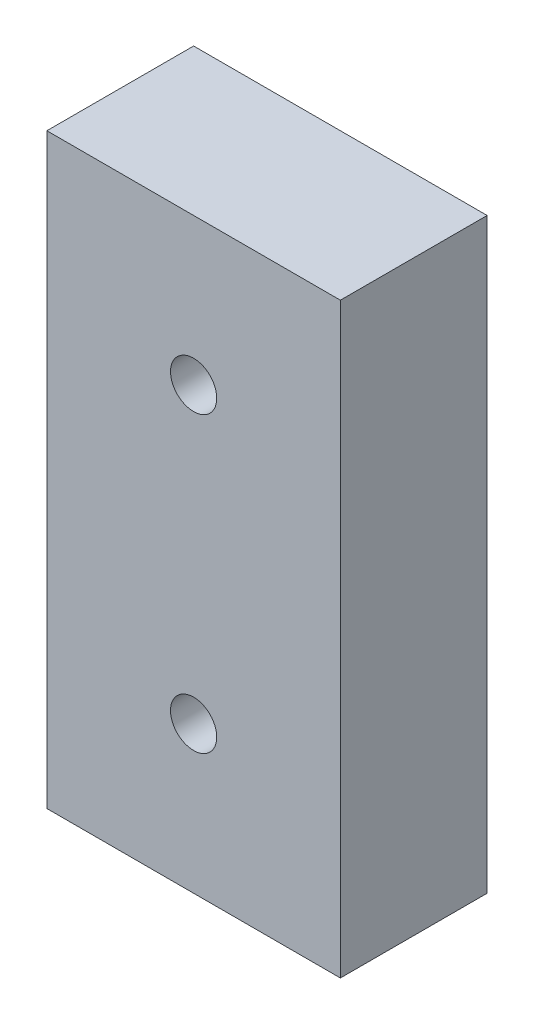
ISO-10303-21;
HEADER;
FILE_DESCRIPTION(('STEP AP214'),'2;1');
FILE_NAME('part.step','',(''),(''),'','','');
FILE_SCHEMA(('AUTOMOTIVE_DESIGN { 1 0 10303 214 1 1 1 1 }'));
ENDSEC;
DATA;
#1=APPLICATION_CONTEXT('core data for automotive mechanical design processes');
#2=APPLICATION_PROTOCOL_DEFINITION('international standard','automotive_design',2000,#1);
#3=PRODUCT_CONTEXT('',#1,'mechanical');
#4=PRODUCT('Part','Part','',(#3));
#5=PRODUCT_RELATED_PRODUCT_CATEGORY('part','',(#4));
#6=PRODUCT_DEFINITION_FORMATION('','',#4);
#7=PRODUCT_DEFINITION_CONTEXT('part definition',#1,'design');
#8=PRODUCT_DEFINITION('design','',#6,#7);
#9=PRODUCT_DEFINITION_SHAPE('','',#8);
#10=(LENGTH_UNIT() NAMED_UNIT(*) SI_UNIT(.MILLI.,.METRE.));
#11=(NAMED_UNIT(*) PLANE_ANGLE_UNIT() SI_UNIT($,.RADIAN.));
#12=(NAMED_UNIT(*) SI_UNIT($,.STERADIAN.) SOLID_ANGLE_UNIT());
#13=UNCERTAINTY_MEASURE_WITH_UNIT(LENGTH_MEASURE(1.E-05),#10,'distance_accuracy_value','');
#14=(GEOMETRIC_REPRESENTATION_CONTEXT(3) GLOBAL_UNCERTAINTY_ASSIGNED_CONTEXT((#13)) GLOBAL_UNIT_ASSIGNED_CONTEXT((#10,
#11,#12)) REPRESENTATION_CONTEXT('',''));
#15=CARTESIAN_POINT('',(0.,0.,0.));
#16=DIRECTION('',(0.,0.,1.));
#17=DIRECTION('',(1.,0.,0.));
#18=AXIS2_PLACEMENT_3D('',#15,#16,#17);
#19=CARTESIAN_POINT('',(0.,0.,10.));
#20=DIRECTION('',(1.,0.,0.));
#21=DIRECTION('',(0.,1.,0.));
#22=AXIS2_PLACEMENT_3D('',#19,#20,#21);
#23=PLANE('',#22);
#24=DIRECTION('',(0.,-1.,0.));
#25=VECTOR('',#24,1.);
#26=CARTESIAN_POINT('',(0.,0.,0.));
#27=LINE('',#26,#25);
#28=CARTESIAN_POINT('',(0.,0.,0.));
#29=VERTEX_POINT('',#28);
#30=CARTESIAN_POINT('',(0.,-40.,0.));
#31=VERTEX_POINT('',#30);
#32=EDGE_CURVE('E111',#29,#31,#27,.T.);
#33=ORIENTED_EDGE('',*,*,#32,.T.);
#34=DIRECTION('',(0.,0.,-1.));
#35=VECTOR('',#34,1.);
#36=CARTESIAN_POINT('',(0.,-40.,10.));
#37=LINE('',#36,#35);
#38=CARTESIAN_POINT('',(0.,-40.,10.));
#39=VERTEX_POINT('',#38);
#40=EDGE_CURVE('E11',#39,#31,#37,.T.);
#41=ORIENTED_EDGE('',*,*,#40,.F.);
#42=DIRECTION('',(0.,-1.,0.));
#43=VECTOR('',#42,1.);
#44=CARTESIAN_POINT('',(0.,0.,10.));
#45=LINE('',#44,#43);
#46=CARTESIAN_POINT('',(0.,0.,10.));
#47=VERTEX_POINT('',#46);
#48=EDGE_CURVE('E95',#47,#39,#45,.T.);
#49=ORIENTED_EDGE('',*,*,#48,.F.);
#50=DIRECTION('',(0.,0.,-1.));
#51=VECTOR('',#50,1.);
#52=CARTESIAN_POINT('',(0.,0.,10.));
#53=LINE('',#52,#51);
#54=EDGE_CURVE('E107',#47,#29,#53,.T.);
#55=ORIENTED_EDGE('',*,*,#54,.T.);
#56=EDGE_LOOP('',(#33,#41,#49,#55));
#57=FACE_BOUND('',#56,.T.);
#58=ADVANCED_FACE('F43',(#57),#23,.F.);
#59=CARTESIAN_POINT('',(0.,-40.,10.));
#60=DIRECTION('',(0.,1.,0.));
#61=DIRECTION('',(0.,0.,1.));
#62=AXIS2_PLACEMENT_3D('',#59,#60,#61);
#63=PLANE('',#62);
#64=DIRECTION('',(1.,0.,0.));
#65=VECTOR('',#64,1.);
#66=CARTESIAN_POINT('',(0.,-40.,0.));
#67=LINE('',#66,#65);
#68=CARTESIAN_POINT('',(20.,-40.,0.));
#69=VERTEX_POINT('',#68);
#70=EDGE_CURVE('E100',#31,#69,#67,.T.);
#71=ORIENTED_EDGE('',*,*,#70,.T.);
#72=DIRECTION('',(0.,0.,-1.));
#73=VECTOR('',#72,1.);
#74=CARTESIAN_POINT('',(20.,-40.,10.));
#75=LINE('',#74,#73);
#76=CARTESIAN_POINT('',(20.,-40.,10.));
#77=VERTEX_POINT('',#76);
#78=EDGE_CURVE('E52',#77,#69,#75,.T.);
#79=ORIENTED_EDGE('',*,*,#78,.F.);
#80=DIRECTION('',(1.,0.,0.));
#81=VECTOR('',#80,1.);
#82=CARTESIAN_POINT('',(0.,-40.,10.));
#83=LINE('',#82,#81);
#84=EDGE_CURVE('E90',#39,#77,#83,.T.);
#85=ORIENTED_EDGE('',*,*,#84,.F.);
#86=ORIENTED_EDGE('',*,*,#40,.T.);
#87=EDGE_LOOP('',(#71,#79,#85,#86));
#88=FACE_BOUND('',#87,.T.);
#89=ADVANCED_FACE('F99',(#88),#63,.F.);
#90=CARTESIAN_POINT('',(20.,0.,10.));
#91=DIRECTION('',(-1.,0.,0.));
#92=DIRECTION('',(0.,0.,1.));
#93=AXIS2_PLACEMENT_3D('',#90,#91,#92);
#94=PLANE('',#93);
#95=DIRECTION('',(0.,1.,0.));
#96=VECTOR('',#95,1.);
#97=CARTESIAN_POINT('',(20.,0.,0.));
#98=LINE('',#97,#96);
#99=CARTESIAN_POINT('',(20.,0.,0.));
#100=VERTEX_POINT('',#99);
#101=EDGE_CURVE('E77',#69,#100,#98,.T.);
#102=ORIENTED_EDGE('',*,*,#101,.T.);
#103=DIRECTION('',(0.,0.,-1.));
#104=VECTOR('',#103,1.);
#105=CARTESIAN_POINT('',(20.,0.,10.));
#106=LINE('',#105,#104);
#107=CARTESIAN_POINT('',(20.,0.,10.));
#108=VERTEX_POINT('',#107);
#109=EDGE_CURVE('E102',#108,#100,#106,.T.);
#110=ORIENTED_EDGE('',*,*,#109,.F.);
#111=DIRECTION('',(0.,1.,0.));
#112=VECTOR('',#111,1.);
#113=CARTESIAN_POINT('',(20.,0.,10.));
#114=LINE('',#113,#112);
#115=EDGE_CURVE('E93',#77,#108,#114,.T.);
#116=ORIENTED_EDGE('',*,*,#115,.F.);
#117=ORIENTED_EDGE('',*,*,#78,.T.);
#118=EDGE_LOOP('',(#102,#110,#116,#117));
#119=FACE_BOUND('',#118,.T.);
#120=ADVANCED_FACE('F103',(#119),#94,.F.);
#121=CARTESIAN_POINT('',(0.,0.,10.));
#122=DIRECTION('',(0.,-1.,0.));
#123=DIRECTION('',(0.,0.,-1.));
#124=AXIS2_PLACEMENT_3D('',#121,#122,#123);
#125=PLANE('',#124);
#126=DIRECTION('',(-1.,0.,0.));
#127=VECTOR('',#126,1.);
#128=CARTESIAN_POINT('',(0.,0.,0.));
#129=LINE('',#128,#127);
#130=EDGE_CURVE('E83',#100,#29,#129,.T.);
#131=ORIENTED_EDGE('',*,*,#130,.T.);
#132=ORIENTED_EDGE('',*,*,#54,.F.);
#133=DIRECTION('',(-1.,0.,0.));
#134=VECTOR('',#133,1.);
#135=CARTESIAN_POINT('',(0.,0.,10.));
#136=LINE('',#135,#134);
#137=EDGE_CURVE('E60',#108,#47,#136,.T.);
#138=ORIENTED_EDGE('',*,*,#137,.F.);
#139=ORIENTED_EDGE('',*,*,#109,.T.);
#140=EDGE_LOOP('',(#131,#132,#138,#139));
#141=FACE_BOUND('',#140,.T.);
#142=ADVANCED_FACE('F125',(#141),#125,.F.);
#143=CARTESIAN_POINT('',(0.,0.,10.));
#144=DIRECTION('',(0.,0.,1.));
#145=DIRECTION('',(1.,0.,0.));
#146=AXIS2_PLACEMENT_3D('',#143,#144,#145);
#147=PLANE('',#146);
#148=CARTESIAN_POINT('',(10.,-10.,10.));
#149=DIRECTION('',(0.,0.,1.));
#150=DIRECTION('',(1.,0.,0.));
#151=AXIS2_PLACEMENT_3D('',#148,#149,#150);
#152=CIRCLE('',#151,1.575);
#153=CARTESIAN_POINT('',(11.575,-10.,10.));
#154=VERTEX_POINT('',#153);
#155=EDGE_CURVE('E140',#154,#154,#152,.T.);
#156=ORIENTED_EDGE('',*,*,#155,.F.);
#157=EDGE_LOOP('',(#156));
#158=FACE_BOUND('',#157,.T.);
#159=CARTESIAN_POINT('',(10.,-30.,10.));
#160=DIRECTION('',(0.,0.,1.));
#161=DIRECTION('',(-1.,0.,0.));
#162=AXIS2_PLACEMENT_3D('',#159,#160,#161);
#163=CIRCLE('',#162,1.575);
#164=CARTESIAN_POINT('',(8.425,-30.,10.));
#165=VERTEX_POINT('',#164);
#166=EDGE_CURVE('E136',#165,#165,#163,.T.);
#167=ORIENTED_EDGE('',*,*,#166,.F.);
#168=EDGE_LOOP('',(#167));
#169=FACE_BOUND('',#168,.T.);
#170=ORIENTED_EDGE('',*,*,#48,.T.);
#171=ORIENTED_EDGE('',*,*,#84,.T.);
#172=ORIENTED_EDGE('',*,*,#115,.T.);
#173=ORIENTED_EDGE('',*,*,#137,.T.);
#174=EDGE_LOOP('',(#170,#171,#172,#173));
#175=FACE_BOUND('',#174,.T.);
#176=ADVANCED_FACE('F91',(#158,#169,#175),#147,.T.);
#177=CARTESIAN_POINT('',(0.,0.,0.));
#178=DIRECTION('',(0.,0.,1.));
#179=DIRECTION('',(1.,0.,0.));
#180=AXIS2_PLACEMENT_3D('',#177,#178,#179);
#181=PLANE('',#180);
#182=CARTESIAN_POINT('',(10.,-10.,0.));
#183=DIRECTION('',(0.,0.,1.));
#184=DIRECTION('',(1.,0.,0.));
#185=AXIS2_PLACEMENT_3D('',#182,#183,#184);
#186=CIRCLE('',#185,1.575);
#187=CARTESIAN_POINT('',(11.575,-10.,0.));
#188=VERTEX_POINT('',#187);
#189=EDGE_CURVE('E115',#188,#188,#186,.T.);
#190=ORIENTED_EDGE('',*,*,#189,.T.);
#191=EDGE_LOOP('',(#190));
#192=FACE_BOUND('',#191,.T.);
#193=CARTESIAN_POINT('',(10.,-30.,0.));
#194=DIRECTION('',(0.,0.,1.));
#195=DIRECTION('',(-1.,0.,0.));
#196=AXIS2_PLACEMENT_3D('',#193,#194,#195);
#197=CIRCLE('',#196,1.575);
#198=CARTESIAN_POINT('',(8.425,-30.,0.));
#199=VERTEX_POINT('',#198);
#200=EDGE_CURVE('E132',#199,#199,#197,.T.);
#201=ORIENTED_EDGE('',*,*,#200,.T.);
#202=EDGE_LOOP('',(#201));
#203=FACE_BOUND('',#202,.T.);
#204=ORIENTED_EDGE('',*,*,#32,.F.);
#205=ORIENTED_EDGE('',*,*,#130,.F.);
#206=ORIENTED_EDGE('',*,*,#101,.F.);
#207=ORIENTED_EDGE('',*,*,#70,.F.);
#208=EDGE_LOOP('',(#204,#205,#206,#207));
#209=FACE_BOUND('',#208,.T.);
#210=ADVANCED_FACE('F128',(#192,#203,#209),#181,.F.);
#211=CARTESIAN_POINT('',(10.,-30.,0.));
#212=DIRECTION('',(0.,0.,1.));
#213=DIRECTION('',(1.,0.,0.));
#214=AXIS2_PLACEMENT_3D('',#211,#212,#213);
#215=CYLINDRICAL_SURFACE('',#214,1.575);
#216=ORIENTED_EDGE('',*,*,#200,.F.);
#217=EDGE_LOOP('',(#216));
#218=FACE_BOUND('',#217,.T.);
#219=ORIENTED_EDGE('',*,*,#166,.T.);
#220=EDGE_LOOP('',(#219));
#221=FACE_BOUND('',#220,.T.);
#222=ADVANCED_FACE('F153',(#218,#221),#215,.F.);
#223=CARTESIAN_POINT('',(10.,-10.,0.));
#224=DIRECTION('',(0.,0.,1.));
#225=DIRECTION('',(1.,0.,0.));
#226=AXIS2_PLACEMENT_3D('',#223,#224,#225);
#227=CYLINDRICAL_SURFACE('',#226,1.575);
#228=ORIENTED_EDGE('',*,*,#189,.F.);
#229=EDGE_LOOP('',(#228));
#230=FACE_BOUND('',#229,.T.);
#231=ORIENTED_EDGE('',*,*,#155,.T.);
#232=EDGE_LOOP('',(#231));
#233=FACE_BOUND('',#232,.T.);
#234=ADVANCED_FACE('F150',(#230,#233),#227,.F.);
#235=CLOSED_SHELL('',(#58,#89,#120,#142,#176,#210,#222,#234));
#236=MANIFOLD_SOLID_BREP('B2',#235);
#237=ADVANCED_BREP_SHAPE_REPRESENTATION('',(#18,#236),#14);
#238=SHAPE_DEFINITION_REPRESENTATION(#9,#237);
ENDSEC;
END-ISO-10303-21;
